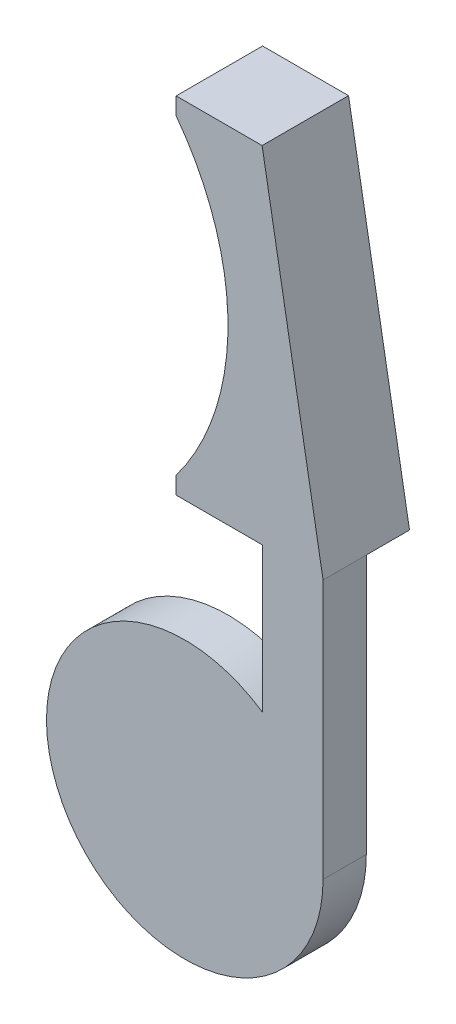
ISO-10303-21;
HEADER;
FILE_DESCRIPTION(('STEP AP214'),'2;1');
FILE_NAME('part.step','',(''),(''),'','','');
FILE_SCHEMA(('AUTOMOTIVE_DESIGN { 1 0 10303 214 1 1 1 1 }'));
ENDSEC;
DATA;
#1=APPLICATION_CONTEXT('core data for automotive mechanical design processes');
#2=APPLICATION_PROTOCOL_DEFINITION('international standard','automotive_design',2000,#1);
#3=PRODUCT_CONTEXT('',#1,'mechanical');
#4=PRODUCT('Part','Part','',(#3));
#5=PRODUCT_RELATED_PRODUCT_CATEGORY('part','',(#4));
#6=PRODUCT_DEFINITION_FORMATION('','',#4);
#7=PRODUCT_DEFINITION_CONTEXT('part definition',#1,'design');
#8=PRODUCT_DEFINITION('design','',#6,#7);
#9=PRODUCT_DEFINITION_SHAPE('','',#8);
#10=(LENGTH_UNIT() NAMED_UNIT(*) SI_UNIT(.MILLI.,.METRE.));
#11=(NAMED_UNIT(*) PLANE_ANGLE_UNIT() SI_UNIT($,.RADIAN.));
#12=(NAMED_UNIT(*) SI_UNIT($,.STERADIAN.) SOLID_ANGLE_UNIT());
#13=UNCERTAINTY_MEASURE_WITH_UNIT(LENGTH_MEASURE(1.E-05),#10,'distance_accuracy_value','');
#14=(GEOMETRIC_REPRESENTATION_CONTEXT(3) GLOBAL_UNCERTAINTY_ASSIGNED_CONTEXT((#13)) GLOBAL_UNIT_ASSIGNED_CONTEXT((#10,
#11,#12)) REPRESENTATION_CONTEXT('',''));
#15=CARTESIAN_POINT('',(0.,0.,0.));
#16=DIRECTION('',(0.,0.,1.));
#17=DIRECTION('',(1.,0.,0.));
#18=AXIS2_PLACEMENT_3D('',#15,#16,#17);
#19=CARTESIAN_POINT('',(0.,0.,6.35));
#20=DIRECTION('',(0.,0.,-1.));
#21=DIRECTION('',(-1.,0.,0.));
#22=AXIS2_PLACEMENT_3D('',#19,#20,#21);
#23=CYLINDRICAL_SURFACE('',#22,20.32);
#24=CARTESIAN_POINT('',(0.,0.,0.));
#25=DIRECTION('',(0.,0.,1.));
#26=DIRECTION('',(1.,0.,0.));
#27=AXIS2_PLACEMENT_3D('',#24,#25,#26);
#28=CIRCLE('',#27,20.32);
#29=CARTESIAN_POINT('',(11.43,16.8005208252602,0.));
#30=VERTEX_POINT('',#29);
#31=CARTESIAN_POINT('',(20.32,0.,0.));
#32=VERTEX_POINT('',#31);
#33=EDGE_CURVE('E201',#30,#32,#28,.T.);
#34=ORIENTED_EDGE('',*,*,#33,.T.);
#35=DIRECTION('',(0.,0.,1.));
#36=VECTOR('',#35,1.);
#37=CARTESIAN_POINT('',(20.32,0.,-39.1234213739034));
#38=LINE('',#37,#36);
#39=CARTESIAN_POINT('',(20.32,0.,6.35));
#40=VERTEX_POINT('',#39);
#41=EDGE_CURVE('E57',#32,#40,#38,.T.);
#42=ORIENTED_EDGE('',*,*,#41,.T.);
#43=CARTESIAN_POINT('',(0.,0.,6.35));
#44=DIRECTION('',(0.,0.,1.));
#45=DIRECTION('',(1.,0.,0.));
#46=AXIS2_PLACEMENT_3D('',#43,#44,#45);
#47=CIRCLE('',#46,20.32);
#48=CARTESIAN_POINT('',(11.43,16.8005208252602,6.35));
#49=VERTEX_POINT('',#48);
#50=EDGE_CURVE('E46',#49,#40,#47,.T.);
#51=ORIENTED_EDGE('',*,*,#50,.F.);
#52=DIRECTION('',(0.,0.,-1.));
#53=VECTOR('',#52,1.);
#54=CARTESIAN_POINT('',(11.43,16.8005208252602,6.35));
#55=LINE('',#54,#53);
#56=EDGE_CURVE('E190',#49,#30,#55,.T.);
#57=ORIENTED_EDGE('',*,*,#56,.T.);
#58=EDGE_LOOP('',(#34,#42,#51,#57));
#59=FACE_BOUND('',#58,.T.);
#60=ADVANCED_FACE('F39',(#59),#23,.T.);
#61=CARTESIAN_POINT('',(0.,0.,6.35));
#62=DIRECTION('',(0.,0.,1.));
#63=DIRECTION('',(1.,0.,0.));
#64=AXIS2_PLACEMENT_3D('',#61,#62,#63);
#65=PLANE('',#64);
#66=ORIENTED_EDGE('',*,*,#50,.T.);
#67=DIRECTION('',(0.,1.,0.));
#68=VECTOR('',#67,1.);
#69=CARTESIAN_POINT('',(20.32,0.,6.35));
#70=LINE('',#69,#68);
#71=CARTESIAN_POINT('',(20.32,38.1,6.35));
#72=VERTEX_POINT('',#71);
#73=EDGE_CURVE('E165',#40,#72,#70,.T.);
#74=ORIENTED_EDGE('',*,*,#73,.T.);
#75=DIRECTION('',(-0.173648177666935,0.984807753012207,0.));
#76=VECTOR('',#75,1.);
#77=CARTESIAN_POINT('',(11.3625893800097,88.9,6.35));
#78=LINE('',#77,#76);
#79=CARTESIAN_POINT('',(11.3625893800097,88.9,6.35));
#80=VERTEX_POINT('',#79);
#81=EDGE_CURVE('E156',#72,#80,#78,.T.);
#82=ORIENTED_EDGE('',*,*,#81,.T.);
#83=DIRECTION('',(-1.,0.,0.));
#84=VECTOR('',#83,1.);
#85=CARTESIAN_POINT('',(-1.27,88.9,6.35));
#86=LINE('',#85,#84);
#87=CARTESIAN_POINT('',(-1.27,88.9,6.35));
#88=VERTEX_POINT('',#87);
#89=EDGE_CURVE('E159',#80,#88,#86,.T.);
#90=ORIENTED_EDGE('',*,*,#89,.T.);
#91=DIRECTION('',(0.,-1.,0.));
#92=VECTOR('',#91,1.);
#93=CARTESIAN_POINT('',(-1.27,86.36,6.35));
#94=LINE('',#93,#92);
#95=CARTESIAN_POINT('',(-1.27,86.36,6.35));
#96=VERTEX_POINT('',#95);
#97=EDGE_CURVE('E142',#88,#96,#94,.T.);
#98=ORIENTED_EDGE('',*,*,#97,.T.);
#99=CARTESIAN_POINT('',(-31.75,63.5,6.35));
#100=DIRECTION('',(0.,0.,-1.));
#101=DIRECTION('',(1.,0.,0.));
#102=AXIS2_PLACEMENT_3D('',#99,#100,#101);
#103=CIRCLE('',#102,38.1);
#104=CARTESIAN_POINT('',(-1.27,40.64,6.35));
#105=VERTEX_POINT('',#104);
#106=EDGE_CURVE('E139',#96,#105,#103,.T.);
#107=ORIENTED_EDGE('',*,*,#106,.T.);
#108=DIRECTION('',(0.,-1.,0.));
#109=VECTOR('',#108,1.);
#110=CARTESIAN_POINT('',(-1.27,38.1,6.35));
#111=LINE('',#110,#109);
#112=CARTESIAN_POINT('',(-1.27,38.1,6.35));
#113=VERTEX_POINT('',#112);
#114=EDGE_CURVE('E153',#105,#113,#111,.T.);
#115=ORIENTED_EDGE('',*,*,#114,.T.);
#116=DIRECTION('',(1.,0.,0.));
#117=VECTOR('',#116,1.);
#118=CARTESIAN_POINT('',(20.32,38.1,6.35));
#119=LINE('',#118,#117);
#120=CARTESIAN_POINT('',(11.43,38.1,6.35));
#121=VERTEX_POINT('',#120);
#122=EDGE_CURVE('E118',#113,#121,#119,.T.);
#123=ORIENTED_EDGE('',*,*,#122,.T.);
#124=DIRECTION('',(0.,-1.,0.));
#125=VECTOR('',#124,1.);
#126=CARTESIAN_POINT('',(11.43,0.,6.35));
#127=LINE('',#126,#125);
#128=EDGE_CURVE('E181',#121,#49,#127,.T.);
#129=ORIENTED_EDGE('',*,*,#128,.T.);
#130=EDGE_LOOP('',(#66,#74,#82,#90,#98,#107,#115,#123,#129));
#131=FACE_BOUND('',#130,.T.);
#132=ADVANCED_FACE('F213',(#131),#65,.T.);
#133=CARTESIAN_POINT('',(0.,0.,0.));
#134=DIRECTION('',(0.,0.,1.));
#135=DIRECTION('',(1.,0.,0.));
#136=AXIS2_PLACEMENT_3D('',#133,#134,#135);
#137=PLANE('',#136);
#138=ORIENTED_EDGE('',*,*,#33,.F.);
#139=DIRECTION('',(0.,1.,0.));
#140=VECTOR('',#139,1.);
#141=CARTESIAN_POINT('',(11.43,0.,0.));
#142=LINE('',#141,#140);
#143=CARTESIAN_POINT('',(11.43,38.1,0.));
#144=VERTEX_POINT('',#143);
#145=EDGE_CURVE('E173',#30,#144,#142,.T.);
#146=ORIENTED_EDGE('',*,*,#145,.T.);
#147=DIRECTION('',(1.,0.,0.));
#148=VECTOR('',#147,1.);
#149=CARTESIAN_POINT('',(20.32,38.1,0.));
#150=LINE('',#149,#148);
#151=CARTESIAN_POINT('',(20.32,38.1,0.));
#152=VERTEX_POINT('',#151);
#153=EDGE_CURVE('E178',#144,#152,#150,.T.);
#154=ORIENTED_EDGE('',*,*,#153,.T.);
#155=DIRECTION('',(0.,-1.,0.));
#156=VECTOR('',#155,1.);
#157=CARTESIAN_POINT('',(20.32,0.,0.));
#158=LINE('',#157,#156);
#159=EDGE_CURVE('E175',#152,#32,#158,.T.);
#160=ORIENTED_EDGE('',*,*,#159,.T.);
#161=EDGE_LOOP('',(#138,#146,#154,#160));
#162=FACE_BOUND('',#161,.T.);
#163=CARTESIAN_POINT('',(0.,0.,0.));
#164=DIRECTION('',(0.,0.,1.));
#165=DIRECTION('',(1.,0.,0.));
#166=AXIS2_PLACEMENT_3D('',#163,#164,#165);
#167=CIRCLE('',#166,4.445);
#168=CARTESIAN_POINT('',(4.445,0.,0.));
#169=VERTEX_POINT('',#168);
#170=EDGE_CURVE('E11',#169,#169,#167,.F.);
#171=ORIENTED_EDGE('',*,*,#170,.F.);
#172=EDGE_LOOP('',(#171));
#173=FACE_BOUND('',#172,.T.);
#174=ADVANCED_FACE('F205',(#162,#173),#137,.F.);
#175=CARTESIAN_POINT('',(0.,0.,-2.54));
#176=DIRECTION('',(0.,0.,-1.));
#177=DIRECTION('',(-1.,0.,0.));
#178=AXIS2_PLACEMENT_3D('',#175,#176,#177);
#179=PLANE('',#178);
#180=CARTESIAN_POINT('',(0.,0.,-2.54));
#181=DIRECTION('',(0.,0.,-1.));
#182=DIRECTION('',(-1.,0.,0.));
#183=AXIS2_PLACEMENT_3D('',#180,#181,#182);
#184=CIRCLE('',#183,4.445);
#185=CARTESIAN_POINT('',(-4.445,0.,-2.54));
#186=VERTEX_POINT('',#185);
#187=EDGE_CURVE('E196',#186,#186,#184,.T.);
#188=ORIENTED_EDGE('',*,*,#187,.T.);
#189=EDGE_LOOP('',(#188));
#190=FACE_BOUND('',#189,.T.);
#191=CARTESIAN_POINT('',(0.,0.,-2.54));
#192=DIRECTION('',(0.,0.,-1.));
#193=DIRECTION('',(-1.,0.,0.));
#194=AXIS2_PLACEMENT_3D('',#191,#192,#193);
#195=CIRCLE('',#194,3.175);
#196=CARTESIAN_POINT('',(-3.175,0.,-2.54));
#197=VERTEX_POINT('',#196);
#198=EDGE_CURVE('E193',#197,#197,#195,.T.);
#199=ORIENTED_EDGE('',*,*,#198,.F.);
#200=EDGE_LOOP('',(#199));
#201=FACE_BOUND('',#200,.T.);
#202=ADVANCED_FACE('F246',(#190,#201),#179,.T.);
#203=CARTESIAN_POINT('',(0.,0.,-2.54));
#204=DIRECTION('',(0.,0.,1.));
#205=DIRECTION('',(1.,0.,0.));
#206=AXIS2_PLACEMENT_3D('',#203,#204,#205);
#207=CYLINDRICAL_SURFACE('',#206,4.445);
#208=ORIENTED_EDGE('',*,*,#187,.F.);
#209=EDGE_LOOP('',(#208));
#210=FACE_BOUND('',#209,.T.);
#211=ORIENTED_EDGE('',*,*,#170,.T.);
#212=EDGE_LOOP('',(#211));
#213=FACE_BOUND('',#212,.T.);
#214=ADVANCED_FACE('F248',(#210,#213),#207,.T.);
#215=CARTESIAN_POINT('',(0.,0.,-2.54));
#216=DIRECTION('',(0.,0.,1.));
#217=DIRECTION('',(1.,0.,0.));
#218=AXIS2_PLACEMENT_3D('',#215,#216,#217);
#219=CYLINDRICAL_SURFACE('',#218,3.175);
#220=ORIENTED_EDGE('',*,*,#198,.T.);
#221=EDGE_LOOP('',(#220));
#222=FACE_BOUND('',#221,.T.);
#223=CARTESIAN_POINT('',(0.,0.,0.));
#224=DIRECTION('',(0.,0.,-1.));
#225=DIRECTION('',(-1.,0.,0.));
#226=AXIS2_PLACEMENT_3D('',#223,#224,#225);
#227=CIRCLE('',#226,3.175);
#228=CARTESIAN_POINT('',(-3.175,0.,0.));
#229=VERTEX_POINT('',#228);
#230=EDGE_CURVE('E192',#229,#229,#227,.T.);
#231=ORIENTED_EDGE('',*,*,#230,.F.);
#232=EDGE_LOOP('',(#231));
#233=FACE_BOUND('',#232,.T.);
#234=ADVANCED_FACE('F236',(#222,#233),#219,.F.);
#235=ORIENTED_EDGE('',*,*,#230,.T.);
#236=EDGE_LOOP('',(#235));
#237=FACE_BOUND('',#236,.T.);
#238=ADVANCED_FACE('F228',(#237),#137,.F.);
#239=CARTESIAN_POINT('',(11.43,0.,-39.1234213739034));
#240=DIRECTION('',(-1.,0.,0.));
#241=DIRECTION('',(0.,0.,1.));
#242=AXIS2_PLACEMENT_3D('',#239,#240,#241);
#243=PLANE('',#242);
#244=ORIENTED_EDGE('',*,*,#56,.F.);
#245=ORIENTED_EDGE('',*,*,#128,.F.);
#246=DIRECTION('',(0.,0.,1.));
#247=VECTOR('',#246,1.);
#248=CARTESIAN_POINT('',(11.43,38.1,-39.1234213739034));
#249=LINE('',#248,#247);
#250=EDGE_CURVE('E186',#144,#121,#249,.T.);
#251=ORIENTED_EDGE('',*,*,#250,.F.);
#252=ORIENTED_EDGE('',*,*,#145,.F.);
#253=EDGE_LOOP('',(#244,#245,#251,#252));
#254=FACE_BOUND('',#253,.T.);
#255=ADVANCED_FACE('F226',(#254),#243,.T.);
#256=CARTESIAN_POINT('',(20.32,0.,-39.1234213739034));
#257=DIRECTION('',(1.,0.,0.));
#258=DIRECTION('',(0.,0.,-1.));
#259=AXIS2_PLACEMENT_3D('',#256,#257,#258);
#260=PLANE('',#259);
#261=ORIENTED_EDGE('',*,*,#159,.F.);
#262=DIRECTION('',(0.,0.,1.));
#263=VECTOR('',#262,1.);
#264=CARTESIAN_POINT('',(20.32,38.1,-39.1234213739034));
#265=LINE('',#264,#263);
#266=EDGE_CURVE('E184',#152,#72,#265,.T.);
#267=ORIENTED_EDGE('',*,*,#266,.T.);
#268=ORIENTED_EDGE('',*,*,#73,.F.);
#269=ORIENTED_EDGE('',*,*,#41,.F.);
#270=EDGE_LOOP('',(#261,#267,#268,#269));
#271=FACE_BOUND('',#270,.T.);
#272=ADVANCED_FACE('F210',(#271),#260,.T.);
#273=CARTESIAN_POINT('',(20.32,38.1,-6.35));
#274=DIRECTION('',(0.,-1.,0.));
#275=DIRECTION('',(0.,0.,-1.));
#276=AXIS2_PLACEMENT_3D('',#273,#274,#275);
#277=PLANE('',#276);
#278=ORIENTED_EDGE('',*,*,#153,.F.);
#279=ORIENTED_EDGE('',*,*,#250,.T.);
#280=ORIENTED_EDGE('',*,*,#122,.F.);
#281=DIRECTION('',(0.,0.,1.));
#282=VECTOR('',#281,1.);
#283=CARTESIAN_POINT('',(-1.27,38.1,-6.35));
#284=LINE('',#283,#282);
#285=CARTESIAN_POINT('',(-1.27,38.1,-6.35));
#286=VERTEX_POINT('',#285);
#287=EDGE_CURVE('E110',#286,#113,#284,.T.);
#288=ORIENTED_EDGE('',*,*,#287,.F.);
#289=DIRECTION('',(1.,0.,0.));
#290=VECTOR('',#289,1.);
#291=CARTESIAN_POINT('',(20.32,38.1,-6.35));
#292=LINE('',#291,#290);
#293=CARTESIAN_POINT('',(20.32,38.1,-6.35));
#294=VERTEX_POINT('',#293);
#295=EDGE_CURVE('E115',#286,#294,#292,.T.);
#296=ORIENTED_EDGE('',*,*,#295,.T.);
#297=DIRECTION('',(0.,0.,1.));
#298=VECTOR('',#297,1.);
#299=CARTESIAN_POINT('',(20.32,38.1,-6.35));
#300=LINE('',#299,#298);
#301=EDGE_CURVE('E123',#294,#152,#300,.T.);
#302=ORIENTED_EDGE('',*,*,#301,.T.);
#303=EDGE_LOOP('',(#278,#279,#280,#288,#296,#302));
#304=FACE_BOUND('',#303,.T.);
#305=ADVANCED_FACE('F113',(#304),#277,.T.);
#306=CARTESIAN_POINT('',(-1.27,38.1,-6.35));
#307=DIRECTION('',(-1.,0.,0.));
#308=DIRECTION('',(0.,0.,1.));
#309=AXIS2_PLACEMENT_3D('',#306,#307,#308);
#310=PLANE('',#309);
#311=ORIENTED_EDGE('',*,*,#114,.F.);
#312=DIRECTION('',(0.,0.,1.));
#313=VECTOR('',#312,1.);
#314=CARTESIAN_POINT('',(-1.27,40.64,-6.35));
#315=LINE('',#314,#313);
#316=CARTESIAN_POINT('',(-1.27,40.64,-6.35));
#317=VERTEX_POINT('',#316);
#318=EDGE_CURVE('E138',#317,#105,#315,.T.);
#319=ORIENTED_EDGE('',*,*,#318,.F.);
#320=DIRECTION('',(0.,-1.,0.));
#321=VECTOR('',#320,1.);
#322=CARTESIAN_POINT('',(-1.27,38.1,-6.35));
#323=LINE('',#322,#321);
#324=EDGE_CURVE('E131',#317,#286,#323,.T.);
#325=ORIENTED_EDGE('',*,*,#324,.T.);
#326=ORIENTED_EDGE('',*,*,#287,.T.);
#327=EDGE_LOOP('',(#311,#319,#325,#326));
#328=FACE_BOUND('',#327,.T.);
#329=ADVANCED_FACE('F137',(#328),#310,.T.);
#330=CARTESIAN_POINT('',(-31.75,63.5,-6.35));
#331=DIRECTION('',(0.,0.,1.));
#332=DIRECTION('',(1.,0.,0.));
#333=AXIS2_PLACEMENT_3D('',#330,#331,#332);
#334=CYLINDRICAL_SURFACE('',#333,38.1);
#335=ORIENTED_EDGE('',*,*,#106,.F.);
#336=DIRECTION('',(0.,0.,1.));
#337=VECTOR('',#336,1.);
#338=CARTESIAN_POINT('',(-1.27,86.36,-6.35));
#339=LINE('',#338,#337);
#340=CARTESIAN_POINT('',(-1.27,86.36,-6.35));
#341=VERTEX_POINT('',#340);
#342=EDGE_CURVE('E166',#341,#96,#339,.T.);
#343=ORIENTED_EDGE('',*,*,#342,.F.);
#344=CARTESIAN_POINT('',(-31.75,63.5,-6.35));
#345=DIRECTION('',(0.,0.,-1.));
#346=DIRECTION('',(1.,0.,0.));
#347=AXIS2_PLACEMENT_3D('',#344,#345,#346);
#348=CIRCLE('',#347,38.1);
#349=EDGE_CURVE('E124',#341,#317,#348,.T.);
#350=ORIENTED_EDGE('',*,*,#349,.T.);
#351=ORIENTED_EDGE('',*,*,#318,.T.);
#352=EDGE_LOOP('',(#335,#343,#350,#351));
#353=FACE_BOUND('',#352,.T.);
#354=ADVANCED_FACE('F223',(#353),#334,.F.);
#355=CARTESIAN_POINT('',(-1.27,86.36,-6.35));
#356=DIRECTION('',(-1.,0.,0.));
#357=DIRECTION('',(0.,0.,1.));
#358=AXIS2_PLACEMENT_3D('',#355,#356,#357);
#359=PLANE('',#358);
#360=ORIENTED_EDGE('',*,*,#97,.F.);
#361=DIRECTION('',(0.,0.,1.));
#362=VECTOR('',#361,1.);
#363=CARTESIAN_POINT('',(-1.27,88.9,-6.35));
#364=LINE('',#363,#362);
#365=CARTESIAN_POINT('',(-1.27,88.9,-6.35));
#366=VERTEX_POINT('',#365);
#367=EDGE_CURVE('E168',#366,#88,#364,.T.);
#368=ORIENTED_EDGE('',*,*,#367,.F.);
#369=DIRECTION('',(0.,-1.,0.));
#370=VECTOR('',#369,1.);
#371=CARTESIAN_POINT('',(-1.27,86.36,-6.35));
#372=LINE('',#371,#370);
#373=EDGE_CURVE('E149',#366,#341,#372,.T.);
#374=ORIENTED_EDGE('',*,*,#373,.T.);
#375=ORIENTED_EDGE('',*,*,#342,.T.);
#376=EDGE_LOOP('',(#360,#368,#374,#375));
#377=FACE_BOUND('',#376,.T.);
#378=ADVANCED_FACE('F317',(#377),#359,.T.);
#379=CARTESIAN_POINT('',(-1.27,88.9,-6.35));
#380=DIRECTION('',(0.,1.,0.));
#381=DIRECTION('',(0.,0.,1.));
#382=AXIS2_PLACEMENT_3D('',#379,#380,#381);
#383=PLANE('',#382);
#384=ORIENTED_EDGE('',*,*,#89,.F.);
#385=DIRECTION('',(0.,0.,1.));
#386=VECTOR('',#385,1.);
#387=CARTESIAN_POINT('',(11.3625893800097,88.9,-6.35));
#388=LINE('',#387,#386);
#389=CARTESIAN_POINT('',(11.3625893800097,88.9,-6.35));
#390=VERTEX_POINT('',#389);
#391=EDGE_CURVE('E170',#390,#80,#388,.T.);
#392=ORIENTED_EDGE('',*,*,#391,.F.);
#393=DIRECTION('',(-1.,0.,0.));
#394=VECTOR('',#393,1.);
#395=CARTESIAN_POINT('',(-1.27,88.9,-6.35));
#396=LINE('',#395,#394);
#397=EDGE_CURVE('E146',#390,#366,#396,.T.);
#398=ORIENTED_EDGE('',*,*,#397,.T.);
#399=ORIENTED_EDGE('',*,*,#367,.T.);
#400=EDGE_LOOP('',(#384,#392,#398,#399));
#401=FACE_BOUND('',#400,.T.);
#402=ADVANCED_FACE('F218',(#401),#383,.T.);
#403=CARTESIAN_POINT('',(11.3625893800097,88.9,-6.35));
#404=DIRECTION('',(0.984807753012207,0.173648177666935,0.));
#405=DIRECTION('',(-0.173648177666935,0.984807753012207,0.));
#406=AXIS2_PLACEMENT_3D('',#403,#404,#405);
#407=PLANE('',#406);
#408=ORIENTED_EDGE('',*,*,#81,.F.);
#409=ORIENTED_EDGE('',*,*,#266,.F.);
#410=ORIENTED_EDGE('',*,*,#301,.F.);
#411=DIRECTION('',(-0.173648177666935,0.984807753012207,0.));
#412=VECTOR('',#411,1.);
#413=CARTESIAN_POINT('',(11.3625893800097,88.9,-6.35));
#414=LINE('',#413,#412);
#415=EDGE_CURVE('E135',#294,#390,#414,.T.);
#416=ORIENTED_EDGE('',*,*,#415,.T.);
#417=ORIENTED_EDGE('',*,*,#391,.T.);
#418=EDGE_LOOP('',(#408,#409,#410,#416,#417));
#419=FACE_BOUND('',#418,.T.);
#420=ADVANCED_FACE('F215',(#419),#407,.T.);
#421=CARTESIAN_POINT('',(-31.75,63.5,-6.35));
#422=DIRECTION('',(0.,0.,1.));
#423=DIRECTION('',(1.,0.,0.));
#424=AXIS2_PLACEMENT_3D('',#421,#422,#423);
#425=PLANE('',#424);
#426=ORIENTED_EDGE('',*,*,#324,.F.);
#427=ORIENTED_EDGE('',*,*,#349,.F.);
#428=ORIENTED_EDGE('',*,*,#373,.F.);
#429=ORIENTED_EDGE('',*,*,#397,.F.);
#430=ORIENTED_EDGE('',*,*,#415,.F.);
#431=ORIENTED_EDGE('',*,*,#295,.F.);
#432=EDGE_LOOP('',(#426,#427,#428,#429,#430,#431));
#433=FACE_BOUND('',#432,.T.);
#434=ADVANCED_FACE('F129',(#433),#425,.F.);
#435=CLOSED_SHELL('',(#60,#132,#174,#202,#214,#234,#238,#255,#272,#305,#329,#354,#378,#402,#420,#434));
#436=MANIFOLD_SOLID_BREP('B2',#435);
#437=ADVANCED_BREP_SHAPE_REPRESENTATION('',(#18,#436),#14);
#438=SHAPE_DEFINITION_REPRESENTATION(#9,#437);
ENDSEC;
END-ISO-10303-21;
